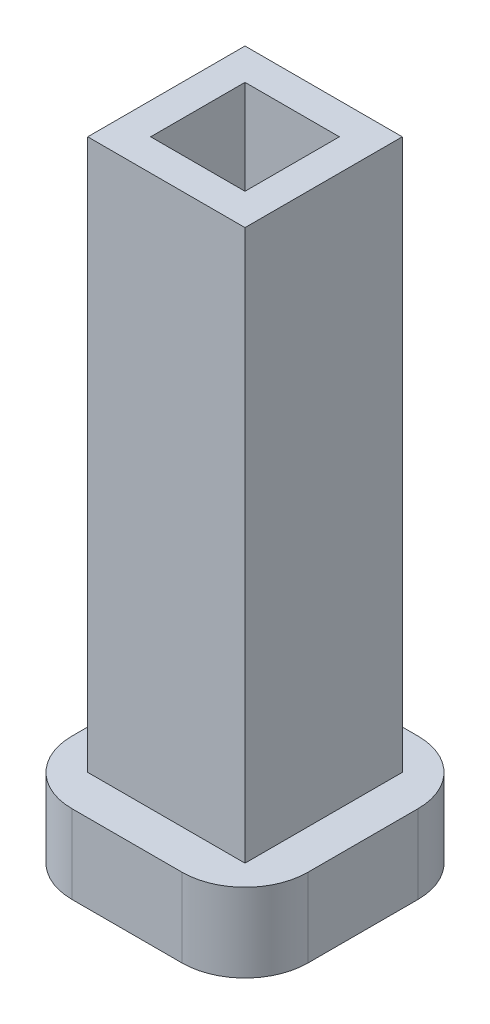
ISO-10303-21;
HEADER;
FILE_DESCRIPTION(('STEP AP214'),'2;1');
FILE_NAME('part.step','',(''),(''),'','','');
FILE_SCHEMA(('AUTOMOTIVE_DESIGN { 1 0 10303 214 1 1 1 1 }'));
ENDSEC;
DATA;
#1=APPLICATION_CONTEXT('core data for automotive mechanical design processes');
#2=APPLICATION_PROTOCOL_DEFINITION('international standard','automotive_design',2000,#1);
#3=PRODUCT_CONTEXT('',#1,'mechanical');
#4=PRODUCT('Part','Part','',(#3));
#5=PRODUCT_RELATED_PRODUCT_CATEGORY('part','',(#4));
#6=PRODUCT_DEFINITION_FORMATION('','',#4);
#7=PRODUCT_DEFINITION_CONTEXT('part definition',#1,'design');
#8=PRODUCT_DEFINITION('design','',#6,#7);
#9=PRODUCT_DEFINITION_SHAPE('','',#8);
#10=(LENGTH_UNIT() NAMED_UNIT(*) SI_UNIT(.MILLI.,.METRE.));
#11=(NAMED_UNIT(*) PLANE_ANGLE_UNIT() SI_UNIT($,.RADIAN.));
#12=(NAMED_UNIT(*) SI_UNIT($,.STERADIAN.) SOLID_ANGLE_UNIT());
#13=UNCERTAINTY_MEASURE_WITH_UNIT(LENGTH_MEASURE(1.E-05),#10,'distance_accuracy_value','');
#14=(GEOMETRIC_REPRESENTATION_CONTEXT(3) GLOBAL_UNCERTAINTY_ASSIGNED_CONTEXT((#13)) GLOBAL_UNIT_ASSIGNED_CONTEXT((#10,
#11,#12)) REPRESENTATION_CONTEXT('',''));
#15=CARTESIAN_POINT('',(0.,0.,0.));
#16=DIRECTION('',(0.,0.,1.));
#17=DIRECTION('',(1.,0.,0.));
#18=AXIS2_PLACEMENT_3D('',#15,#16,#17);
#19=CARTESIAN_POINT('',(0.,5.,0.));
#20=DIRECTION('',(1.,0.,0.));
#21=DIRECTION('',(0.,0.,-1.00000000000005));
#22=AXIS2_PLACEMENT_3D('',#19,#20,#21);
#23=PLANE('',#22);
#24=DIRECTION('',(0.,0.,1.00000000000005));
#25=VECTOR('',#24,1.);
#26=CARTESIAN_POINT('',(0.,0.,0.));
#27=LINE('',#26,#25);
#28=CARTESIAN_POINT('',(0.,0.,4.));
#29=VERTEX_POINT('',#28);
#30=CARTESIAN_POINT('',(7.28583859910259E-13,0.,11.0000000000004));
#31=VERTEX_POINT('',#30);
#32=EDGE_CURVE('E256',#29,#31,#27,.T.);
#33=ORIENTED_EDGE('',*,*,#32,.T.);
#34=DIRECTION('',(0.,-1.00000000000005,0.));
#35=VECTOR('',#34,1.);
#36=CARTESIAN_POINT('',(0.,5.,11.0000000000004));
#37=LINE('',#36,#35);
#38=CARTESIAN_POINT('',(0.,5.,11.0000000000004));
#39=VERTEX_POINT('',#38);
#40=EDGE_CURVE('E311',#31,#39,#37,.F.);
#41=ORIENTED_EDGE('',*,*,#40,.T.);
#42=DIRECTION('',(0.,0.,1.00000000000005));
#43=VECTOR('',#42,1.);
#44=CARTESIAN_POINT('',(0.,5.,0.));
#45=LINE('',#44,#43);
#46=CARTESIAN_POINT('',(0.,5.,4.));
#47=VERTEX_POINT('',#46);
#48=EDGE_CURVE('E257',#47,#39,#45,.T.);
#49=ORIENTED_EDGE('',*,*,#48,.F.);
#50=DIRECTION('',(0.,-1.00000000000005,0.));
#51=VECTOR('',#50,1.);
#52=CARTESIAN_POINT('',(0.,5.,4.));
#53=LINE('',#52,#51);
#54=EDGE_CURVE('E307',#47,#29,#53,.T.);
#55=ORIENTED_EDGE('',*,*,#54,.T.);
#56=EDGE_LOOP('',(#33,#41,#49,#55));
#57=FACE_BOUND('',#56,.T.);
#58=ADVANCED_FACE('F47',(#57),#23,.F.);
#59=CARTESIAN_POINT('',(0.,5.,15.0000000000007));
#60=DIRECTION('',(0.,0.,-1.00000000000005));
#61=DIRECTION('',(-1.,0.,0.));
#62=AXIS2_PLACEMENT_3D('',#59,#60,#61);
#63=PLANE('',#62);
#64=DIRECTION('',(1.,0.,0.));
#65=VECTOR('',#64,1.);
#66=CARTESIAN_POINT('',(0.,5.,15.0000000000007));
#67=LINE('',#66,#65);
#68=CARTESIAN_POINT('',(4.,5.,15.0000000000007));
#69=VERTEX_POINT('',#68);
#70=CARTESIAN_POINT('',(11.,5.,15.0000000000007));
#71=VERTEX_POINT('',#70);
#72=EDGE_CURVE('E261',#69,#71,#67,.T.);
#73=ORIENTED_EDGE('',*,*,#72,.F.);
#74=DIRECTION('',(0.,-1.00000000000005,0.));
#75=VECTOR('',#74,1.);
#76=CARTESIAN_POINT('',(4.,5.,15.0000000000007));
#77=LINE('',#76,#75);
#78=CARTESIAN_POINT('',(4.,0.,15.0000000000007));
#79=VERTEX_POINT('',#78);
#80=EDGE_CURVE('E291',#69,#79,#77,.T.);
#81=ORIENTED_EDGE('',*,*,#80,.T.);
#82=DIRECTION('',(1.,0.,0.));
#83=VECTOR('',#82,1.);
#84=CARTESIAN_POINT('',(0.,0.,15.0000000000007));
#85=LINE('',#84,#83);
#86=CARTESIAN_POINT('',(11.,0.,15.0000000000007));
#87=VERTEX_POINT('',#86);
#88=EDGE_CURVE('E278',#79,#87,#85,.T.);
#89=ORIENTED_EDGE('',*,*,#88,.T.);
#90=DIRECTION('',(0.,-1.00000000000005,0.));
#91=VECTOR('',#90,1.);
#92=CARTESIAN_POINT('',(11.,5.,15.0000000000007));
#93=LINE('',#92,#91);
#94=EDGE_CURVE('E274',#87,#71,#93,.F.);
#95=ORIENTED_EDGE('',*,*,#94,.T.);
#96=EDGE_LOOP('',(#73,#81,#89,#95));
#97=FACE_BOUND('',#96,.T.);
#98=ADVANCED_FACE('F358',(#97),#63,.F.);
#99=CARTESIAN_POINT('',(15.,5.,-1.82145964977565E-13));
#100=DIRECTION('',(-1.,0.,0.));
#101=DIRECTION('',(0.,0.,1.00000000000005));
#102=AXIS2_PLACEMENT_3D('',#99,#100,#101);
#103=PLANE('',#102);
#104=DIRECTION('',(0.,0.,-1.00000000000005));
#105=VECTOR('',#104,1.);
#106=CARTESIAN_POINT('',(15.,5.,-1.82145964977565E-13));
#107=LINE('',#106,#105);
#108=CARTESIAN_POINT('',(15.,5.,11.0000000000007));
#109=VERTEX_POINT('',#108);
#110=CARTESIAN_POINT('',(15.,5.,4.));
#111=VERTEX_POINT('',#110);
#112=EDGE_CURVE('E266',#109,#111,#107,.T.);
#113=ORIENTED_EDGE('',*,*,#112,.F.);
#114=DIRECTION('',(0.,-1.00000000000005,0.));
#115=VECTOR('',#114,1.);
#116=CARTESIAN_POINT('',(15.,5.,11.0000000000007));
#117=LINE('',#116,#115);
#118=CARTESIAN_POINT('',(15.0000000000007,0.,11.0000000000007));
#119=VERTEX_POINT('',#118);
#120=EDGE_CURVE('E329',#109,#119,#117,.T.);
#121=ORIENTED_EDGE('',*,*,#120,.T.);
#122=DIRECTION('',(0.,0.,-1.00000000000005));
#123=VECTOR('',#122,1.);
#124=CARTESIAN_POINT('',(15.,0.,-1.82145964977565E-13));
#125=LINE('',#124,#123);
#126=CARTESIAN_POINT('',(15.,0.,4.));
#127=VERTEX_POINT('',#126);
#128=EDGE_CURVE('E282',#119,#127,#125,.T.);
#129=ORIENTED_EDGE('',*,*,#128,.T.);
#130=DIRECTION('',(0.,-1.00000000000005,0.));
#131=VECTOR('',#130,1.);
#132=CARTESIAN_POINT('',(15.,5.,4.));
#133=LINE('',#132,#131);
#134=EDGE_CURVE('E326',#127,#111,#133,.F.);
#135=ORIENTED_EDGE('',*,*,#134,.T.);
#136=EDGE_LOOP('',(#113,#121,#129,#135));
#137=FACE_BOUND('',#136,.T.);
#138=ADVANCED_FACE('F367',(#137),#103,.F.);
#139=CARTESIAN_POINT('',(0.,5.,0.));
#140=DIRECTION('',(0.,0.,1.00000000000005));
#141=DIRECTION('',(1.,0.,0.));
#142=AXIS2_PLACEMENT_3D('',#139,#140,#141);
#143=PLANE('',#142);
#144=DIRECTION('',(-1.,0.,0.));
#145=VECTOR('',#144,1.);
#146=CARTESIAN_POINT('',(0.,5.,0.));
#147=LINE('',#146,#145);
#148=CARTESIAN_POINT('',(11.,5.,0.));
#149=VERTEX_POINT('',#148);
#150=CARTESIAN_POINT('',(4.,5.,-1.82145964977565E-13));
#151=VERTEX_POINT('',#150);
#152=EDGE_CURVE('E270',#149,#151,#147,.T.);
#153=ORIENTED_EDGE('',*,*,#152,.F.);
#154=DIRECTION('',(0.,-1.00000000000005,0.));
#155=VECTOR('',#154,1.);
#156=CARTESIAN_POINT('',(11.,5.,0.));
#157=LINE('',#156,#155);
#158=CARTESIAN_POINT('',(11.,0.,0.));
#159=VERTEX_POINT('',#158);
#160=EDGE_CURVE('E11',#149,#159,#157,.T.);
#161=ORIENTED_EDGE('',*,*,#160,.T.);
#162=DIRECTION('',(-1.,0.,0.));
#163=VECTOR('',#162,1.);
#164=CARTESIAN_POINT('',(0.,0.,0.));
#165=LINE('',#164,#163);
#166=CARTESIAN_POINT('',(4.,0.,-1.82145964977565E-13));
#167=VERTEX_POINT('',#166);
#168=EDGE_CURVE('E262',#159,#167,#165,.T.);
#169=ORIENTED_EDGE('',*,*,#168,.T.);
#170=DIRECTION('',(0.,-1.00000000000005,0.));
#171=VECTOR('',#170,1.);
#172=CARTESIAN_POINT('',(4.,5.,-1.82145964977565E-13));
#173=LINE('',#172,#171);
#174=EDGE_CURVE('E56',#167,#151,#173,.F.);
#175=ORIENTED_EDGE('',*,*,#174,.T.);
#176=EDGE_LOOP('',(#153,#161,#169,#175));
#177=FACE_BOUND('',#176,.T.);
#178=ADVANCED_FACE('F338',(#177),#143,.F.);
#179=CARTESIAN_POINT('',(0.,5.,0.));
#180=DIRECTION('',(0.,1.00000000000005,0.));
#181=DIRECTION('',(0.,0.,1.00000000000005));
#182=AXIS2_PLACEMENT_3D('',#179,#180,#181);
#183=PLANE('',#182);
#184=DIRECTION('',(0.,0.,1.00000000000005));
#185=VECTOR('',#184,1.);
#186=CARTESIAN_POINT('',(2.5,5.,2.5));
#187=LINE('',#186,#185);
#188=CARTESIAN_POINT('',(2.5,5.,2.5));
#189=VERTEX_POINT('',#188);
#190=CARTESIAN_POINT('',(2.5,5.,12.5000000000007));
#191=VERTEX_POINT('',#190);
#192=EDGE_CURVE('E206',#189,#191,#187,.T.);
#193=ORIENTED_EDGE('',*,*,#192,.F.);
#194=DIRECTION('',(-1.,0.,0.));
#195=VECTOR('',#194,1.);
#196=CARTESIAN_POINT('',(2.5,5.,2.5));
#197=LINE('',#196,#195);
#198=CARTESIAN_POINT('',(12.5,5.,2.5));
#199=VERTEX_POINT('',#198);
#200=EDGE_CURVE('E217',#199,#189,#197,.T.);
#201=ORIENTED_EDGE('',*,*,#200,.F.);
#202=DIRECTION('',(0.,0.,-1.00000000000005));
#203=VECTOR('',#202,1.);
#204=CARTESIAN_POINT('',(12.5,5.,2.5));
#205=LINE('',#204,#203);
#206=CARTESIAN_POINT('',(12.5,5.,12.5000000000007));
#207=VERTEX_POINT('',#206);
#208=EDGE_CURVE('E234',#207,#199,#205,.T.);
#209=ORIENTED_EDGE('',*,*,#208,.F.);
#210=DIRECTION('',(1.,0.,0.));
#211=VECTOR('',#210,1.);
#212=CARTESIAN_POINT('',(2.5,5.,12.5000000000007));
#213=LINE('',#212,#211);
#214=EDGE_CURVE('E230',#191,#207,#213,.T.);
#215=ORIENTED_EDGE('',*,*,#214,.F.);
#216=EDGE_LOOP('',(#193,#201,#209,#215));
#217=FACE_BOUND('',#216,.T.);
#218=ORIENTED_EDGE('',*,*,#48,.T.);
#219=CARTESIAN_POINT('',(4.,5.,11.0000000000004));
#220=DIRECTION('',(0.,1.00000000000005,0.));
#221=DIRECTION('',(0.,0.,1.00000000000005));
#222=AXIS2_PLACEMENT_3D('',#219,#220,#221);
#223=CIRCLE('',#222,4.);
#224=EDGE_CURVE('E323',#39,#69,#223,.T.);
#225=ORIENTED_EDGE('',*,*,#224,.T.);
#226=ORIENTED_EDGE('',*,*,#72,.T.);
#227=CARTESIAN_POINT('',(11.,5.,11.0000000000007));
#228=DIRECTION('',(0.,1.00000000000005,0.));
#229=DIRECTION('',(0.,0.,1.00000000000005));
#230=AXIS2_PLACEMENT_3D('',#227,#228,#229);
#231=CIRCLE('',#230,4.);
#232=EDGE_CURVE('E320',#71,#109,#231,.T.);
#233=ORIENTED_EDGE('',*,*,#232,.T.);
#234=ORIENTED_EDGE('',*,*,#112,.T.);
#235=CARTESIAN_POINT('',(11.,5.,4.));
#236=DIRECTION('',(0.,1.00000000000005,0.));
#237=DIRECTION('',(0.,0.,1.00000000000005));
#238=AXIS2_PLACEMENT_3D('',#235,#236,#237);
#239=CIRCLE('',#238,4.);
#240=EDGE_CURVE('E317',#111,#149,#239,.T.);
#241=ORIENTED_EDGE('',*,*,#240,.T.);
#242=ORIENTED_EDGE('',*,*,#152,.T.);
#243=CARTESIAN_POINT('',(4.,5.,4.));
#244=DIRECTION('',(0.,1.00000000000005,0.));
#245=DIRECTION('',(0.,0.,1.00000000000005));
#246=AXIS2_PLACEMENT_3D('',#243,#244,#245);
#247=CIRCLE('',#246,4.);
#248=EDGE_CURVE('E314',#151,#47,#247,.T.);
#249=ORIENTED_EDGE('',*,*,#248,.T.);
#250=EDGE_LOOP('',(#218,#225,#226,#233,#234,#241,#242,#249));
#251=FACE_BOUND('',#250,.T.);
#252=ADVANCED_FACE('F344',(#217,#251),#183,.T.);
#253=CARTESIAN_POINT('',(0.,0.,0.));
#254=DIRECTION('',(0.,1.00000000000005,0.));
#255=DIRECTION('',(0.,0.,1.00000000000005));
#256=AXIS2_PLACEMENT_3D('',#253,#254,#255);
#257=PLANE('',#256);
#258=DIRECTION('',(-1.,0.,0.));
#259=VECTOR('',#258,1.);
#260=CARTESIAN_POINT('',(4.50000000000073,0.,4.5));
#261=LINE('',#260,#259);
#262=CARTESIAN_POINT('',(10.5000000000007,0.,4.5));
#263=VERTEX_POINT('',#262);
#264=CARTESIAN_POINT('',(4.50000000000073,0.,4.5));
#265=VERTEX_POINT('',#264);
#266=EDGE_CURVE('E170',#263,#265,#261,.T.);
#267=ORIENTED_EDGE('',*,*,#266,.T.);
#268=DIRECTION('',(0.,0.,1.00000000000005));
#269=VECTOR('',#268,1.);
#270=CARTESIAN_POINT('',(4.50000000000073,0.,4.5));
#271=LINE('',#270,#269);
#272=CARTESIAN_POINT('',(4.50000000000001,0.,10.5000000000007));
#273=VERTEX_POINT('',#272);
#274=EDGE_CURVE('E163',#265,#273,#271,.T.);
#275=ORIENTED_EDGE('',*,*,#274,.T.);
#276=DIRECTION('',(1.,0.,0.));
#277=VECTOR('',#276,1.);
#278=CARTESIAN_POINT('',(4.50000000000001,0.,10.5000000000007));
#279=LINE('',#278,#277);
#280=CARTESIAN_POINT('',(10.5,0.,10.5000000000004));
#281=VERTEX_POINT('',#280);
#282=EDGE_CURVE('E173',#273,#281,#279,.T.);
#283=ORIENTED_EDGE('',*,*,#282,.T.);
#284=DIRECTION('',(0.,0.,-1.00000000000005));
#285=VECTOR('',#284,1.);
#286=CARTESIAN_POINT('',(10.5000000000007,0.,4.5));
#287=LINE('',#286,#285);
#288=EDGE_CURVE('E63',#281,#263,#287,.T.);
#289=ORIENTED_EDGE('',*,*,#288,.T.);
#290=EDGE_LOOP('',(#267,#275,#283,#289));
#291=FACE_BOUND('',#290,.T.);
#292=ORIENTED_EDGE('',*,*,#88,.F.);
#293=CARTESIAN_POINT('',(4.00000000000072,-7.28583859910259E-13,11.0000000000004));
#294=DIRECTION('',(0.,1.00000000000005,0.));
#295=DIRECTION('',(0.,0.,1.00000000000005));
#296=AXIS2_PLACEMENT_3D('',#293,#294,#295);
#297=CIRCLE('',#296,4.);
#298=EDGE_CURVE('E304',#79,#31,#297,.F.);
#299=ORIENTED_EDGE('',*,*,#298,.T.);
#300=ORIENTED_EDGE('',*,*,#32,.F.);
#301=CARTESIAN_POINT('',(4.,0.,4.));
#302=DIRECTION('',(0.,1.00000000000005,0.));
#303=DIRECTION('',(0.,0.,1.00000000000005));
#304=AXIS2_PLACEMENT_3D('',#301,#302,#303);
#305=CIRCLE('',#304,4.);
#306=EDGE_CURVE('E295',#29,#167,#305,.F.);
#307=ORIENTED_EDGE('',*,*,#306,.T.);
#308=ORIENTED_EDGE('',*,*,#168,.F.);
#309=CARTESIAN_POINT('',(11.,0.,4.));
#310=DIRECTION('',(0.,1.00000000000005,0.));
#311=DIRECTION('',(0.,0.,1.00000000000005));
#312=AXIS2_PLACEMENT_3D('',#309,#310,#311);
#313=CIRCLE('',#312,4.);
#314=EDGE_CURVE('E298',#159,#127,#313,.F.);
#315=ORIENTED_EDGE('',*,*,#314,.T.);
#316=ORIENTED_EDGE('',*,*,#128,.F.);
#317=CARTESIAN_POINT('',(11.0000000000007,0.,11.0000000000007));
#318=DIRECTION('',(0.,1.00000000000005,0.));
#319=DIRECTION('',(0.,0.,1.00000000000005));
#320=AXIS2_PLACEMENT_3D('',#317,#318,#319);
#321=CIRCLE('',#320,4.);
#322=EDGE_CURVE('E301',#119,#87,#321,.F.);
#323=ORIENTED_EDGE('',*,*,#322,.T.);
#324=EDGE_LOOP('',(#292,#299,#300,#307,#308,#315,#316,#323));
#325=FACE_BOUND('',#324,.T.);
#326=ADVANCED_FACE('F178',(#291,#325),#257,.F.);
#327=CARTESIAN_POINT('',(2.5,40.0000000000015,2.5));
#328=DIRECTION('',(1.,0.,0.));
#329=DIRECTION('',(0.,0.,-1.00000000000005));
#330=AXIS2_PLACEMENT_3D('',#327,#328,#329);
#331=PLANE('',#330);
#332=ORIENTED_EDGE('',*,*,#192,.T.);
#333=DIRECTION('',(0.,-1.00000000000005,0.));
#334=VECTOR('',#333,1.);
#335=CARTESIAN_POINT('',(2.50000000000072,40.0000000000015,12.5000000000007));
#336=LINE('',#335,#334);
#337=CARTESIAN_POINT('',(2.50000000000072,40.0000000000015,12.5000000000007));
#338=VERTEX_POINT('',#337);
#339=EDGE_CURVE('E252',#338,#191,#336,.T.);
#340=ORIENTED_EDGE('',*,*,#339,.F.);
#341=DIRECTION('',(0.,0.,1.00000000000005));
#342=VECTOR('',#341,1.);
#343=CARTESIAN_POINT('',(2.5,40.0000000000015,2.5));
#344=LINE('',#343,#342);
#345=CARTESIAN_POINT('',(2.5,40.0000000000015,2.5));
#346=VERTEX_POINT('',#345);
#347=EDGE_CURVE('E212',#346,#338,#344,.T.);
#348=ORIENTED_EDGE('',*,*,#347,.F.);
#349=DIRECTION('',(0.,-1.00000000000005,0.));
#350=VECTOR('',#349,1.);
#351=CARTESIAN_POINT('',(2.5,40.0000000000015,2.5));
#352=LINE('',#351,#350);
#353=EDGE_CURVE('E226',#346,#189,#352,.T.);
#354=ORIENTED_EDGE('',*,*,#353,.T.);
#355=EDGE_LOOP('',(#332,#340,#348,#354));
#356=FACE_BOUND('',#355,.T.);
#357=ADVANCED_FACE('F409',(#356),#331,.F.);
#358=CARTESIAN_POINT('',(2.50000000000072,40.0000000000015,12.5000000000007));
#359=DIRECTION('',(0.,0.,-1.00000000000005));
#360=DIRECTION('',(-1.,0.,0.));
#361=AXIS2_PLACEMENT_3D('',#358,#359,#360);
#362=PLANE('',#361);
#363=ORIENTED_EDGE('',*,*,#214,.T.);
#364=DIRECTION('',(0.,-1.00000000000005,0.));
#365=VECTOR('',#364,1.);
#366=CARTESIAN_POINT('',(12.5000000000007,40.0000000000015,12.5000000000007));
#367=LINE('',#366,#365);
#368=CARTESIAN_POINT('',(12.5000000000007,40.0000000000015,12.5000000000007));
#369=VERTEX_POINT('',#368);
#370=EDGE_CURVE('E248',#369,#207,#367,.T.);
#371=ORIENTED_EDGE('',*,*,#370,.F.);
#372=DIRECTION('',(1.,0.,0.));
#373=VECTOR('',#372,1.);
#374=CARTESIAN_POINT('',(2.50000000000072,40.0000000000015,12.5000000000007));
#375=LINE('',#374,#373);
#376=EDGE_CURVE('E216',#338,#369,#375,.T.);
#377=ORIENTED_EDGE('',*,*,#376,.F.);
#378=ORIENTED_EDGE('',*,*,#339,.T.);
#379=EDGE_LOOP('',(#363,#371,#377,#378));
#380=FACE_BOUND('',#379,.T.);
#381=ADVANCED_FACE('F405',(#380),#362,.F.);
#382=CARTESIAN_POINT('',(12.5,40.0000000000015,2.50000000000036));
#383=DIRECTION('',(-1.,0.,0.));
#384=DIRECTION('',(0.,0.,1.00000000000005));
#385=AXIS2_PLACEMENT_3D('',#382,#383,#384);
#386=PLANE('',#385);
#387=ORIENTED_EDGE('',*,*,#208,.T.);
#388=DIRECTION('',(0.,-1.00000000000005,0.));
#389=VECTOR('',#388,1.);
#390=CARTESIAN_POINT('',(12.5,40.0000000000015,2.50000000000036));
#391=LINE('',#390,#389);
#392=CARTESIAN_POINT('',(12.5,40.0000000000015,2.50000000000036));
#393=VERTEX_POINT('',#392);
#394=EDGE_CURVE('E244',#393,#199,#391,.T.);
#395=ORIENTED_EDGE('',*,*,#394,.F.);
#396=DIRECTION('',(0.,0.,-1.00000000000005));
#397=VECTOR('',#396,1.);
#398=CARTESIAN_POINT('',(12.5,40.0000000000015,2.50000000000036));
#399=LINE('',#398,#397);
#400=EDGE_CURVE('E220',#369,#393,#399,.T.);
#401=ORIENTED_EDGE('',*,*,#400,.F.);
#402=ORIENTED_EDGE('',*,*,#370,.T.);
#403=EDGE_LOOP('',(#387,#395,#401,#402));
#404=FACE_BOUND('',#403,.T.);
#405=ADVANCED_FACE('F396',(#404),#386,.F.);
#406=CARTESIAN_POINT('',(2.5,40.0000000000015,2.5));
#407=DIRECTION('',(0.,0.,1.00000000000005));
#408=DIRECTION('',(1.,0.,0.));
#409=AXIS2_PLACEMENT_3D('',#406,#407,#408);
#410=PLANE('',#409);
#411=ORIENTED_EDGE('',*,*,#200,.T.);
#412=ORIENTED_EDGE('',*,*,#353,.F.);
#413=DIRECTION('',(-1.,0.,0.));
#414=VECTOR('',#413,1.);
#415=CARTESIAN_POINT('',(2.5,40.0000000000015,2.5));
#416=LINE('',#415,#414);
#417=EDGE_CURVE('E223',#393,#346,#416,.T.);
#418=ORIENTED_EDGE('',*,*,#417,.F.);
#419=ORIENTED_EDGE('',*,*,#394,.T.);
#420=EDGE_LOOP('',(#411,#412,#418,#419));
#421=FACE_BOUND('',#420,.T.);
#422=ADVANCED_FACE('F390',(#421),#410,.F.);
#423=CARTESIAN_POINT('',(0.,40.0000000000015,0.));
#424=DIRECTION('',(0.,1.00000000000005,0.));
#425=DIRECTION('',(0.,0.,1.00000000000005));
#426=AXIS2_PLACEMENT_3D('',#423,#424,#425);
#427=PLANE('',#426);
#428=DIRECTION('',(0.,0.,1.00000000000005));
#429=VECTOR('',#428,1.);
#430=CARTESIAN_POINT('',(4.50000000000073,40.0000000000015,4.5));
#431=LINE('',#430,#429);
#432=CARTESIAN_POINT('',(4.50000000000073,40.0000000000015,4.5));
#433=VERTEX_POINT('',#432);
#434=CARTESIAN_POINT('',(4.5,40.0000000000015,10.5000000000007));
#435=VERTEX_POINT('',#434);
#436=EDGE_CURVE('E71',#433,#435,#431,.T.);
#437=ORIENTED_EDGE('',*,*,#436,.F.);
#438=DIRECTION('',(-1.,0.,0.));
#439=VECTOR('',#438,1.);
#440=CARTESIAN_POINT('',(4.50000000000073,40.0000000000015,4.5));
#441=LINE('',#440,#439);
#442=CARTESIAN_POINT('',(10.5000000000007,40.0000000000015,4.5));
#443=VERTEX_POINT('',#442);
#444=EDGE_CURVE('E182',#443,#433,#441,.T.);
#445=ORIENTED_EDGE('',*,*,#444,.F.);
#446=DIRECTION('',(0.,0.,-1.00000000000005));
#447=VECTOR('',#446,1.);
#448=CARTESIAN_POINT('',(10.5000000000007,40.0000000000015,4.5));
#449=LINE('',#448,#447);
#450=CARTESIAN_POINT('',(10.5,40.0000000000015,10.5000000000007));
#451=VERTEX_POINT('',#450);
#452=EDGE_CURVE('E188',#451,#443,#449,.T.);
#453=ORIENTED_EDGE('',*,*,#452,.F.);
#454=DIRECTION('',(1.,0.,0.));
#455=VECTOR('',#454,1.);
#456=CARTESIAN_POINT('',(4.5,40.0000000000015,10.5000000000007));
#457=LINE('',#456,#455);
#458=EDGE_CURVE('E197',#435,#451,#457,.T.);
#459=ORIENTED_EDGE('',*,*,#458,.F.);
#460=EDGE_LOOP('',(#437,#445,#453,#459));
#461=FACE_BOUND('',#460,.T.);
#462=ORIENTED_EDGE('',*,*,#347,.T.);
#463=ORIENTED_EDGE('',*,*,#376,.T.);
#464=ORIENTED_EDGE('',*,*,#400,.T.);
#465=ORIENTED_EDGE('',*,*,#417,.T.);
#466=EDGE_LOOP('',(#462,#463,#464,#465));
#467=FACE_BOUND('',#466,.T.);
#468=ADVANCED_FACE('F386',(#461,#467),#427,.T.);
#469=CARTESIAN_POINT('',(4.,5.,11.0000000000004));
#470=DIRECTION('',(0.,-1.00000000000005,0.));
#471=DIRECTION('',(0.,0.,-1.00000000000005));
#472=AXIS2_PLACEMENT_3D('',#469,#470,#471);
#473=CYLINDRICAL_SURFACE('',#472,4.);
#474=ORIENTED_EDGE('',*,*,#224,.F.);
#475=ORIENTED_EDGE('',*,*,#40,.F.);
#476=ORIENTED_EDGE('',*,*,#298,.F.);
#477=ORIENTED_EDGE('',*,*,#80,.F.);
#478=EDGE_LOOP('',(#474,#475,#476,#477));
#479=FACE_BOUND('',#478,.T.);
#480=ADVANCED_FACE('F355',(#479),#473,.T.);
#481=CARTESIAN_POINT('',(11.,5.,11.0000000000007));
#482=DIRECTION('',(0.,-1.00000000000005,0.));
#483=DIRECTION('',(0.,0.,-1.00000000000005));
#484=AXIS2_PLACEMENT_3D('',#481,#482,#483);
#485=CYLINDRICAL_SURFACE('',#484,4.);
#486=ORIENTED_EDGE('',*,*,#232,.F.);
#487=ORIENTED_EDGE('',*,*,#94,.F.);
#488=ORIENTED_EDGE('',*,*,#322,.F.);
#489=ORIENTED_EDGE('',*,*,#120,.F.);
#490=EDGE_LOOP('',(#486,#487,#488,#489));
#491=FACE_BOUND('',#490,.T.);
#492=ADVANCED_FACE('F364',(#491),#485,.T.);
#493=CARTESIAN_POINT('',(11.,5.,4.));
#494=DIRECTION('',(0.,-1.00000000000005,0.));
#495=DIRECTION('',(0.,0.,-1.00000000000005));
#496=AXIS2_PLACEMENT_3D('',#493,#494,#495);
#497=CYLINDRICAL_SURFACE('',#496,4.);
#498=ORIENTED_EDGE('',*,*,#240,.F.);
#499=ORIENTED_EDGE('',*,*,#134,.F.);
#500=ORIENTED_EDGE('',*,*,#314,.F.);
#501=ORIENTED_EDGE('',*,*,#160,.F.);
#502=EDGE_LOOP('',(#498,#499,#500,#501));
#503=FACE_BOUND('',#502,.T.);
#504=ADVANCED_FACE('F370',(#503),#497,.T.);
#505=CARTESIAN_POINT('',(4.,5.,4.));
#506=DIRECTION('',(0.,-1.00000000000005,0.));
#507=DIRECTION('',(0.,0.,-1.00000000000005));
#508=AXIS2_PLACEMENT_3D('',#505,#506,#507);
#509=CYLINDRICAL_SURFACE('',#508,4.);
#510=ORIENTED_EDGE('',*,*,#248,.F.);
#511=ORIENTED_EDGE('',*,*,#174,.F.);
#512=ORIENTED_EDGE('',*,*,#306,.F.);
#513=ORIENTED_EDGE('',*,*,#54,.F.);
#514=EDGE_LOOP('',(#510,#511,#512,#513));
#515=FACE_BOUND('',#514,.T.);
#516=ADVANCED_FACE('F49',(#515),#509,.T.);
#517=CARTESIAN_POINT('',(4.50000000000073,0.,4.5));
#518=DIRECTION('',(-1.,0.,0.));
#519=DIRECTION('',(0.,0.,1.00000000000005));
#520=AXIS2_PLACEMENT_3D('',#517,#518,#519);
#521=PLANE('',#520);
#522=ORIENTED_EDGE('',*,*,#436,.T.);
#523=DIRECTION('',(0.,1.00000000000005,0.));
#524=VECTOR('',#523,1.);
#525=CARTESIAN_POINT('',(4.50000000000001,0.,10.5000000000007));
#526=LINE('',#525,#524);
#527=EDGE_CURVE('E159',#273,#435,#526,.T.);
#528=ORIENTED_EDGE('',*,*,#527,.F.);
#529=ORIENTED_EDGE('',*,*,#274,.F.);
#530=DIRECTION('',(0.,1.00000000000005,0.));
#531=VECTOR('',#530,1.);
#532=CARTESIAN_POINT('',(4.50000000000073,0.,4.5));
#533=LINE('',#532,#531);
#534=EDGE_CURVE('E203',#265,#433,#533,.T.);
#535=ORIENTED_EDGE('',*,*,#534,.T.);
#536=EDGE_LOOP('',(#522,#528,#529,#535));
#537=FACE_BOUND('',#536,.T.);
#538=ADVANCED_FACE('F161',(#537),#521,.F.);
#539=CARTESIAN_POINT('',(4.50000000000073,0.,4.5));
#540=DIRECTION('',(0.,0.,-1.00000000000005));
#541=DIRECTION('',(-1.,0.,0.));
#542=AXIS2_PLACEMENT_3D('',#539,#540,#541);
#543=PLANE('',#542);
#544=ORIENTED_EDGE('',*,*,#444,.T.);
#545=ORIENTED_EDGE('',*,*,#534,.F.);
#546=ORIENTED_EDGE('',*,*,#266,.F.);
#547=DIRECTION('',(0.,1.00000000000005,0.));
#548=VECTOR('',#547,1.);
#549=CARTESIAN_POINT('',(10.5000000000007,0.,4.5));
#550=LINE('',#549,#548);
#551=EDGE_CURVE('E207',#263,#443,#550,.T.);
#552=ORIENTED_EDGE('',*,*,#551,.T.);
#553=EDGE_LOOP('',(#544,#545,#546,#552));
#554=FACE_BOUND('',#553,.T.);
#555=ADVANCED_FACE('F492',(#554),#543,.F.);
#556=CARTESIAN_POINT('',(10.5000000000007,0.,4.5));
#557=DIRECTION('',(1.,0.,0.));
#558=DIRECTION('',(0.,0.,-1.00000000000005));
#559=AXIS2_PLACEMENT_3D('',#556,#557,#558);
#560=PLANE('',#559);
#561=ORIENTED_EDGE('',*,*,#452,.T.);
#562=ORIENTED_EDGE('',*,*,#551,.F.);
#563=ORIENTED_EDGE('',*,*,#288,.F.);
#564=DIRECTION('',(0.,1.00000000000005,0.));
#565=VECTOR('',#564,1.);
#566=CARTESIAN_POINT('',(10.5,0.,10.5000000000004));
#567=LINE('',#566,#565);
#568=EDGE_CURVE('E169',#281,#451,#567,.T.);
#569=ORIENTED_EDGE('',*,*,#568,.T.);
#570=EDGE_LOOP('',(#561,#562,#563,#569));
#571=FACE_BOUND('',#570,.T.);
#572=ADVANCED_FACE('F501',(#571),#560,.F.);
#573=CARTESIAN_POINT('',(4.50000000000001,0.,10.5000000000007));
#574=DIRECTION('',(0.,0.,1.00000000000005));
#575=DIRECTION('',(1.,0.,0.));
#576=AXIS2_PLACEMENT_3D('',#573,#574,#575);
#577=PLANE('',#576);
#578=ORIENTED_EDGE('',*,*,#458,.T.);
#579=ORIENTED_EDGE('',*,*,#568,.F.);
#580=ORIENTED_EDGE('',*,*,#282,.F.);
#581=ORIENTED_EDGE('',*,*,#527,.T.);
#582=EDGE_LOOP('',(#578,#579,#580,#581));
#583=FACE_BOUND('',#582,.T.);
#584=ADVANCED_FACE('F174',(#583),#577,.F.);
#585=CLOSED_SHELL('',(#58,#98,#138,#178,#252,#326,#357,#381,#405,#422,#468,#480,#492,#504,#516,
#538,#555,#572,#584));
#586=MANIFOLD_SOLID_BREP('B2',#585);
#587=ADVANCED_BREP_SHAPE_REPRESENTATION('',(#18,#586),#14);
#588=SHAPE_DEFINITION_REPRESENTATION(#9,#587);
ENDSEC;
END-ISO-10303-21;
